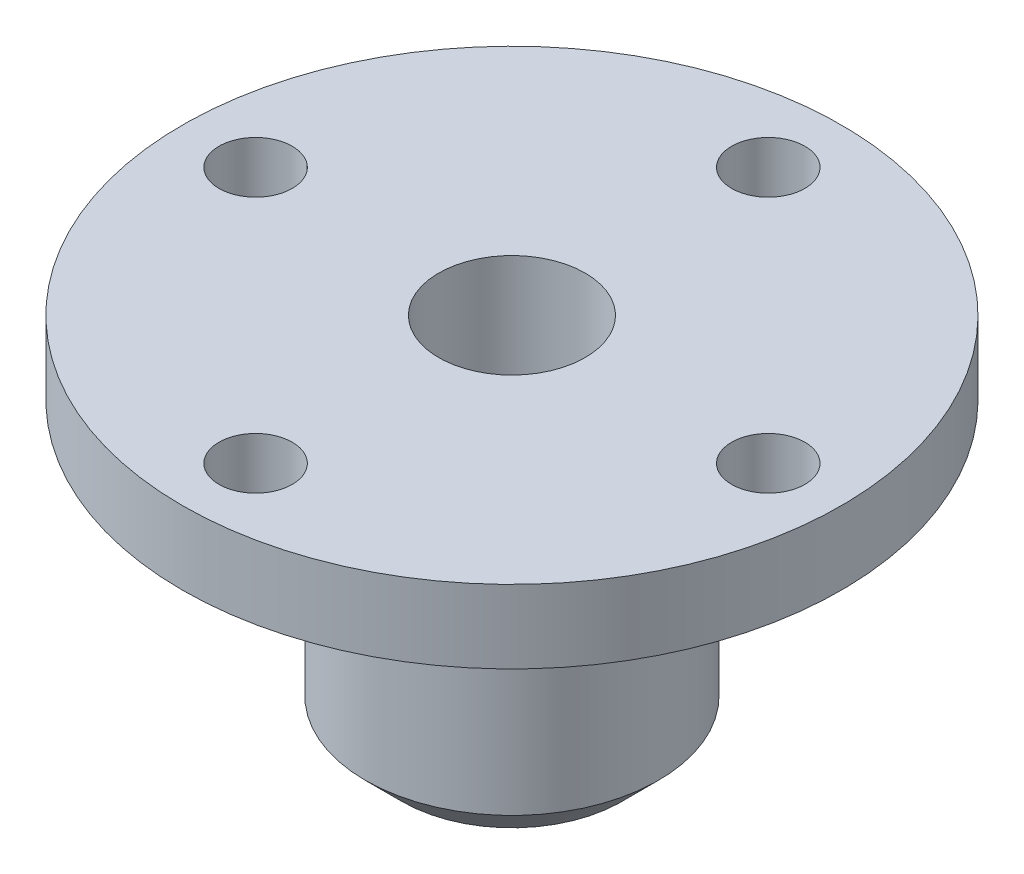
ISO-10303-21;
HEADER;
FILE_DESCRIPTION(('STEP AP214'),'2;1');
FILE_NAME('part.step','',(''),(''),'','','');
FILE_SCHEMA(('AUTOMOTIVE_DESIGN { 1 0 10303 214 1 1 1 1 }'));
ENDSEC;
DATA;
#1=APPLICATION_CONTEXT('core data for automotive mechanical design processes');
#2=APPLICATION_PROTOCOL_DEFINITION('international standard','automotive_design',2000,#1);
#3=PRODUCT_CONTEXT('',#1,'mechanical');
#4=PRODUCT('Part','Part','',(#3));
#5=PRODUCT_RELATED_PRODUCT_CATEGORY('part','',(#4));
#6=PRODUCT_DEFINITION_FORMATION('','',#4);
#7=PRODUCT_DEFINITION_CONTEXT('part definition',#1,'design');
#8=PRODUCT_DEFINITION('design','',#6,#7);
#9=PRODUCT_DEFINITION_SHAPE('','',#8);
#10=(LENGTH_UNIT() NAMED_UNIT(*) SI_UNIT(.MILLI.,.METRE.));
#11=(NAMED_UNIT(*) PLANE_ANGLE_UNIT() SI_UNIT($,.RADIAN.));
#12=(NAMED_UNIT(*) SI_UNIT($,.STERADIAN.) SOLID_ANGLE_UNIT());
#13=UNCERTAINTY_MEASURE_WITH_UNIT(LENGTH_MEASURE(1.E-05),#10,'distance_accuracy_value','');
#14=(GEOMETRIC_REPRESENTATION_CONTEXT(3) GLOBAL_UNCERTAINTY_ASSIGNED_CONTEXT((#13)) GLOBAL_UNIT_ASSIGNED_CONTEXT((#10,
#11,#12)) REPRESENTATION_CONTEXT('',''));
#15=CARTESIAN_POINT('',(0.,0.,0.));
#16=DIRECTION('',(0.,0.,1.));
#17=DIRECTION('',(1.,0.,0.));
#18=AXIS2_PLACEMENT_3D('',#15,#16,#17);
#19=CARTESIAN_POINT('',(0.,10.,0.));
#20=DIRECTION('',(0.,-1.,0.));
#21=DIRECTION('',(0.,0.,-1.));
#22=AXIS2_PLACEMENT_3D('',#19,#20,#21);
#23=CYLINDRICAL_SURFACE('',#22,45.);
#24=CARTESIAN_POINT('',(0.,10.,0.));
#25=DIRECTION('',(0.,1.,0.));
#26=DIRECTION('',(0.,0.,1.));
#27=AXIS2_PLACEMENT_3D('',#24,#25,#26);
#28=CIRCLE('',#27,45.);
#29=CARTESIAN_POINT('',(0.,10.,45.));
#30=VERTEX_POINT('',#29);
#31=EDGE_CURVE('E66',#30,#30,#28,.T.);
#32=ORIENTED_EDGE('',*,*,#31,.F.);
#33=EDGE_LOOP('',(#32));
#34=FACE_BOUND('',#33,.T.);
#35=CARTESIAN_POINT('',(0.,0.,0.));
#36=DIRECTION('',(0.,1.,0.));
#37=DIRECTION('',(0.,0.,1.));
#38=AXIS2_PLACEMENT_3D('',#35,#36,#37);
#39=CIRCLE('',#38,45.);
#40=CARTESIAN_POINT('',(0.,0.,45.));
#41=VERTEX_POINT('',#40);
#42=EDGE_CURVE('E72',#41,#41,#39,.T.);
#43=ORIENTED_EDGE('',*,*,#42,.T.);
#44=EDGE_LOOP('',(#43));
#45=FACE_BOUND('',#44,.T.);
#46=ADVANCED_FACE('F44',(#34,#45),#23,.T.);
#47=CARTESIAN_POINT('',(0.,10.,0.));
#48=DIRECTION('',(0.,1.,0.));
#49=DIRECTION('',(0.,0.,1.));
#50=AXIS2_PLACEMENT_3D('',#47,#48,#49);
#51=PLANE('',#50);
#52=CARTESIAN_POINT('',(0.,10.,0.));
#53=DIRECTION('',(0.,-1.,0.));
#54=DIRECTION('',(0.,0.,-1.));
#55=AXIS2_PLACEMENT_3D('',#52,#53,#54);
#56=CIRCLE('',#55,10.);
#57=CARTESIAN_POINT('',(0.,10.,-10.));
#58=VERTEX_POINT('',#57);
#59=EDGE_CURVE('E95',#58,#58,#56,.T.);
#60=ORIENTED_EDGE('',*,*,#59,.T.);
#61=EDGE_LOOP('',(#60));
#62=FACE_BOUND('',#61,.T.);
#63=CARTESIAN_POINT('',(-35.,10.,1.2220184685951E-13));
#64=DIRECTION('',(0.,1.,0.));
#65=DIRECTION('',(1.,0.,0.));
#66=AXIS2_PLACEMENT_3D('',#63,#64,#65);
#67=CIRCLE('',#66,5.);
#68=CARTESIAN_POINT('',(-30.,10.,1.04744440165294E-13));
#69=VERTEX_POINT('',#68);
#70=EDGE_CURVE('E102',#69,#69,#67,.T.);
#71=ORIENTED_EDGE('',*,*,#70,.F.);
#72=EDGE_LOOP('',(#71));
#73=FACE_BOUND('',#72,.T.);
#74=CARTESIAN_POINT('',(0.,10.,35.));
#75=DIRECTION('',(0.,1.,0.));
#76=DIRECTION('',(0.,0.,-1.));
#77=AXIS2_PLACEMENT_3D('',#74,#75,#76);
#78=CIRCLE('',#77,5.);
#79=CARTESIAN_POINT('',(0.,10.,30.));
#80=VERTEX_POINT('',#79);
#81=EDGE_CURVE('E96',#80,#80,#78,.T.);
#82=ORIENTED_EDGE('',*,*,#81,.F.);
#83=EDGE_LOOP('',(#82));
#84=FACE_BOUND('',#83,.T.);
#85=CARTESIAN_POINT('',(35.,10.,-3.66605540578529E-13));
#86=DIRECTION('',(0.,1.,0.));
#87=DIRECTION('',(-1.,0.,0.));
#88=AXIS2_PLACEMENT_3D('',#85,#86,#87);
#89=CIRCLE('',#88,5.);
#90=CARTESIAN_POINT('',(30.,10.,-3.14233320495882E-13));
#91=VERTEX_POINT('',#90);
#92=EDGE_CURVE('E87',#91,#91,#89,.T.);
#93=ORIENTED_EDGE('',*,*,#92,.F.);
#94=EDGE_LOOP('',(#93));
#95=FACE_BOUND('',#94,.T.);
#96=CARTESIAN_POINT('',(0.,10.,-35.));
#97=DIRECTION('',(0.,1.,0.));
#98=DIRECTION('',(0.,0.,1.));
#99=AXIS2_PLACEMENT_3D('',#96,#97,#98);
#100=CIRCLE('',#99,5.);
#101=CARTESIAN_POINT('',(0.,10.,-30.));
#102=VERTEX_POINT('',#101);
#103=EDGE_CURVE('E78',#102,#102,#100,.T.);
#104=ORIENTED_EDGE('',*,*,#103,.F.);
#105=EDGE_LOOP('',(#104));
#106=FACE_BOUND('',#105,.T.);
#107=ORIENTED_EDGE('',*,*,#31,.T.);
#108=EDGE_LOOP('',(#107));
#109=FACE_BOUND('',#108,.T.);
#110=ADVANCED_FACE('F118',(#62,#73,#84,#95,#106,#109),#51,.T.);
#111=CARTESIAN_POINT('',(0.,0.,0.));
#112=DIRECTION('',(0.,1.,0.));
#113=DIRECTION('',(0.,0.,1.));
#114=AXIS2_PLACEMENT_3D('',#111,#112,#113);
#115=PLANE('',#114);
#116=CARTESIAN_POINT('',(0.,0.,0.));
#117=DIRECTION('',(0.,1.,0.));
#118=DIRECTION('',(0.,0.,1.));
#119=AXIS2_PLACEMENT_3D('',#116,#117,#118);
#120=CIRCLE('',#119,25.);
#121=CARTESIAN_POINT('',(0.,0.,25.));
#122=VERTEX_POINT('',#121);
#123=EDGE_CURVE('E63',#122,#122,#120,.T.);
#124=ORIENTED_EDGE('',*,*,#123,.T.);
#125=EDGE_LOOP('',(#124));
#126=FACE_BOUND('',#125,.T.);
#127=CARTESIAN_POINT('',(-35.,0.,1.2220184685951E-13));
#128=DIRECTION('',(0.,1.,0.));
#129=DIRECTION('',(1.,0.,0.));
#130=AXIS2_PLACEMENT_3D('',#127,#128,#129);
#131=CIRCLE('',#130,5.);
#132=CARTESIAN_POINT('',(-30.,0.,1.04744440165294E-13));
#133=VERTEX_POINT('',#132);
#134=EDGE_CURVE('E83',#133,#133,#131,.T.);
#135=ORIENTED_EDGE('',*,*,#134,.T.);
#136=EDGE_LOOP('',(#135));
#137=FACE_BOUND('',#136,.T.);
#138=CARTESIAN_POINT('',(0.,0.,35.));
#139=DIRECTION('',(0.,1.,0.));
#140=DIRECTION('',(0.,0.,-1.));
#141=AXIS2_PLACEMENT_3D('',#138,#139,#140);
#142=CIRCLE('',#141,5.);
#143=CARTESIAN_POINT('',(0.,0.,30.));
#144=VERTEX_POINT('',#143);
#145=EDGE_CURVE('E99',#144,#144,#142,.T.);
#146=ORIENTED_EDGE('',*,*,#145,.T.);
#147=EDGE_LOOP('',(#146));
#148=FACE_BOUND('',#147,.T.);
#149=CARTESIAN_POINT('',(35.,0.,-3.66605540578529E-13));
#150=DIRECTION('',(0.,1.,0.));
#151=DIRECTION('',(-1.,0.,0.));
#152=AXIS2_PLACEMENT_3D('',#149,#150,#151);
#153=CIRCLE('',#152,5.);
#154=CARTESIAN_POINT('',(30.,0.,-3.14233320495882E-13));
#155=VERTEX_POINT('',#154);
#156=EDGE_CURVE('E93',#155,#155,#153,.T.);
#157=ORIENTED_EDGE('',*,*,#156,.T.);
#158=EDGE_LOOP('',(#157));
#159=FACE_BOUND('',#158,.T.);
#160=CARTESIAN_POINT('',(0.,0.,-35.));
#161=DIRECTION('',(0.,1.,0.));
#162=DIRECTION('',(0.,0.,1.));
#163=AXIS2_PLACEMENT_3D('',#160,#161,#162);
#164=CIRCLE('',#163,5.);
#165=CARTESIAN_POINT('',(0.,0.,-30.));
#166=VERTEX_POINT('',#165);
#167=EDGE_CURVE('E73',#166,#166,#164,.T.);
#168=ORIENTED_EDGE('',*,*,#167,.T.);
#169=EDGE_LOOP('',(#168));
#170=FACE_BOUND('',#169,.T.);
#171=ORIENTED_EDGE('',*,*,#42,.F.);
#172=EDGE_LOOP('',(#171));
#173=FACE_BOUND('',#172,.T.);
#174=ADVANCED_FACE('F148',(#126,#137,#148,#159,#170,#173),#115,.F.);
#175=CARTESIAN_POINT('',(0.,0.,-35.));
#176=DIRECTION('',(0.,1.,0.));
#177=DIRECTION('',(0.,0.,1.));
#178=AXIS2_PLACEMENT_3D('',#175,#176,#177);
#179=CYLINDRICAL_SURFACE('',#178,5.);
#180=ORIENTED_EDGE('',*,*,#167,.F.);
#181=EDGE_LOOP('',(#180));
#182=FACE_BOUND('',#181,.T.);
#183=ORIENTED_EDGE('',*,*,#103,.T.);
#184=EDGE_LOOP('',(#183));
#185=FACE_BOUND('',#184,.T.);
#186=ADVANCED_FACE('F165',(#182,#185),#179,.F.);
#187=CARTESIAN_POINT('',(35.,0.,-3.66605540578529E-13));
#188=DIRECTION('',(0.,1.,0.));
#189=DIRECTION('',(0.,0.,1.));
#190=AXIS2_PLACEMENT_3D('',#187,#188,#189);
#191=CYLINDRICAL_SURFACE('',#190,5.);
#192=ORIENTED_EDGE('',*,*,#156,.F.);
#193=EDGE_LOOP('',(#192));
#194=FACE_BOUND('',#193,.T.);
#195=ORIENTED_EDGE('',*,*,#92,.T.);
#196=EDGE_LOOP('',(#195));
#197=FACE_BOUND('',#196,.T.);
#198=ADVANCED_FACE('F173',(#194,#197),#191,.F.);
#199=CARTESIAN_POINT('',(0.,0.,35.));
#200=DIRECTION('',(0.,1.,0.));
#201=DIRECTION('',(0.,0.,1.));
#202=AXIS2_PLACEMENT_3D('',#199,#200,#201);
#203=CYLINDRICAL_SURFACE('',#202,5.);
#204=ORIENTED_EDGE('',*,*,#145,.F.);
#205=EDGE_LOOP('',(#204));
#206=FACE_BOUND('',#205,.T.);
#207=ORIENTED_EDGE('',*,*,#81,.T.);
#208=EDGE_LOOP('',(#207));
#209=FACE_BOUND('',#208,.T.);
#210=ADVANCED_FACE('F185',(#206,#209),#203,.F.);
#211=CARTESIAN_POINT('',(-35.,0.,1.2220184685951E-13));
#212=DIRECTION('',(0.,1.,0.));
#213=DIRECTION('',(0.,0.,1.));
#214=AXIS2_PLACEMENT_3D('',#211,#212,#213);
#215=CYLINDRICAL_SURFACE('',#214,5.);
#216=ORIENTED_EDGE('',*,*,#134,.F.);
#217=EDGE_LOOP('',(#216));
#218=FACE_BOUND('',#217,.T.);
#219=ORIENTED_EDGE('',*,*,#70,.T.);
#220=EDGE_LOOP('',(#219));
#221=FACE_BOUND('',#220,.T.);
#222=ADVANCED_FACE('F140',(#218,#221),#215,.F.);
#223=CARTESIAN_POINT('',(0.,-40.,0.));
#224=DIRECTION('',(0.,1.,0.));
#225=DIRECTION('',(0.,0.,1.));
#226=AXIS2_PLACEMENT_3D('',#223,#224,#225);
#227=CYLINDRICAL_SURFACE('',#226,20.);
#228=CARTESIAN_POINT('',(0.,-35.,0.));
#229=DIRECTION('',(0.,1.,0.));
#230=DIRECTION('',(0.,0.,1.));
#231=AXIS2_PLACEMENT_3D('',#228,#229,#230);
#232=CIRCLE('',#231,20.);
#233=CARTESIAN_POINT('',(0.,-35.,20.));
#234=VERTEX_POINT('',#233);
#235=EDGE_CURVE('E53',#234,#234,#232,.T.);
#236=ORIENTED_EDGE('',*,*,#235,.T.);
#237=EDGE_LOOP('',(#236));
#238=FACE_BOUND('',#237,.T.);
#239=CARTESIAN_POINT('',(0.,-5.,0.));
#240=DIRECTION('',(0.,1.,0.));
#241=DIRECTION('',(0.,0.,1.));
#242=AXIS2_PLACEMENT_3D('',#239,#240,#241);
#243=CIRCLE('',#242,20.);
#244=CARTESIAN_POINT('',(0.,-5.,20.));
#245=VERTEX_POINT('',#244);
#246=EDGE_CURVE('E56',#245,#245,#243,.F.);
#247=ORIENTED_EDGE('',*,*,#246,.T.);
#248=EDGE_LOOP('',(#247));
#249=FACE_BOUND('',#248,.T.);
#250=ADVANCED_FACE('F131',(#238,#249),#227,.T.);
#251=CARTESIAN_POINT('',(0.,-40.,0.));
#252=DIRECTION('',(0.,1.,0.));
#253=DIRECTION('',(0.,0.,1.));
#254=AXIS2_PLACEMENT_3D('',#251,#252,#253);
#255=PLANE('',#254);
#256=CARTESIAN_POINT('',(0.,-40.,0.));
#257=DIRECTION('',(0.,1.,0.));
#258=DIRECTION('',(0.,0.,1.));
#259=AXIS2_PLACEMENT_3D('',#256,#257,#258);
#260=CIRCLE('',#259,15.);
#261=CARTESIAN_POINT('',(0.,-40.,15.));
#262=VERTEX_POINT('',#261);
#263=EDGE_CURVE('E10',#262,#262,#260,.F.);
#264=ORIENTED_EDGE('',*,*,#263,.T.);
#265=EDGE_LOOP('',(#264));
#266=FACE_BOUND('',#265,.T.);
#267=CARTESIAN_POINT('',(0.,-40.,0.));
#268=DIRECTION('',(0.,-1.,0.));
#269=DIRECTION('',(0.,0.,-1.));
#270=AXIS2_PLACEMENT_3D('',#267,#268,#269);
#271=CIRCLE('',#270,10.);
#272=CARTESIAN_POINT('',(0.,-40.,-10.));
#273=VERTEX_POINT('',#272);
#274=EDGE_CURVE('E112',#273,#273,#271,.T.);
#275=ORIENTED_EDGE('',*,*,#274,.F.);
#276=EDGE_LOOP('',(#275));
#277=FACE_BOUND('',#276,.T.);
#278=ADVANCED_FACE('F127',(#266,#277),#255,.F.);
#279=CARTESIAN_POINT('',(0.,10.,0.));
#280=DIRECTION('',(0.,-1.,0.));
#281=DIRECTION('',(0.,0.,-1.));
#282=AXIS2_PLACEMENT_3D('',#279,#280,#281);
#283=CYLINDRICAL_SURFACE('',#282,10.);
#284=ORIENTED_EDGE('',*,*,#59,.F.);
#285=EDGE_LOOP('',(#284));
#286=FACE_BOUND('',#285,.T.);
#287=ORIENTED_EDGE('',*,*,#274,.T.);
#288=EDGE_LOOP('',(#287));
#289=FACE_BOUND('',#288,.T.);
#290=ADVANCED_FACE('F125',(#286,#289),#283,.F.);
#291=CARTESIAN_POINT('',(0.,-5.,0.));
#292=DIRECTION('',(0.,1.,0.));
#293=DIRECTION('',(0.,0.,1.));
#294=AXIS2_PLACEMENT_3D('',#291,#292,#293);
#295=TOROIDAL_SURFACE('',#294,25.,5.);
#296=ORIENTED_EDGE('',*,*,#246,.F.);
#297=EDGE_LOOP('',(#296));
#298=FACE_BOUND('',#297,.T.);
#299=ORIENTED_EDGE('',*,*,#123,.F.);
#300=EDGE_LOOP('',(#299));
#301=FACE_BOUND('',#300,.T.);
#302=ADVANCED_FACE('F121',(#298,#301),#295,.F.);
#303=CARTESIAN_POINT('',(0.,-35.,0.));
#304=DIRECTION('',(0.,1.,0.));
#305=DIRECTION('',(0.,0.,1.));
#306=AXIS2_PLACEMENT_3D('',#303,#304,#305);
#307=CONICAL_SURFACE('',#306,20.,0.785398163397449);
#308=ORIENTED_EDGE('',*,*,#263,.F.);
#309=EDGE_LOOP('',(#308));
#310=FACE_BOUND('',#309,.T.);
#311=ORIENTED_EDGE('',*,*,#235,.F.);
#312=EDGE_LOOP('',(#311));
#313=FACE_BOUND('',#312,.T.);
#314=ADVANCED_FACE('F48',(#310,#313),#307,.T.);
#315=CLOSED_SHELL('',(#46,#110,#174,#186,#198,#210,#222,#250,#278,#290,#302,#314));
#316=MANIFOLD_SOLID_BREP('B2',#315);
#317=ADVANCED_BREP_SHAPE_REPRESENTATION('',(#18,#316),#14);
#318=SHAPE_DEFINITION_REPRESENTATION(#9,#317);
ENDSEC;
END-ISO-10303-21;
